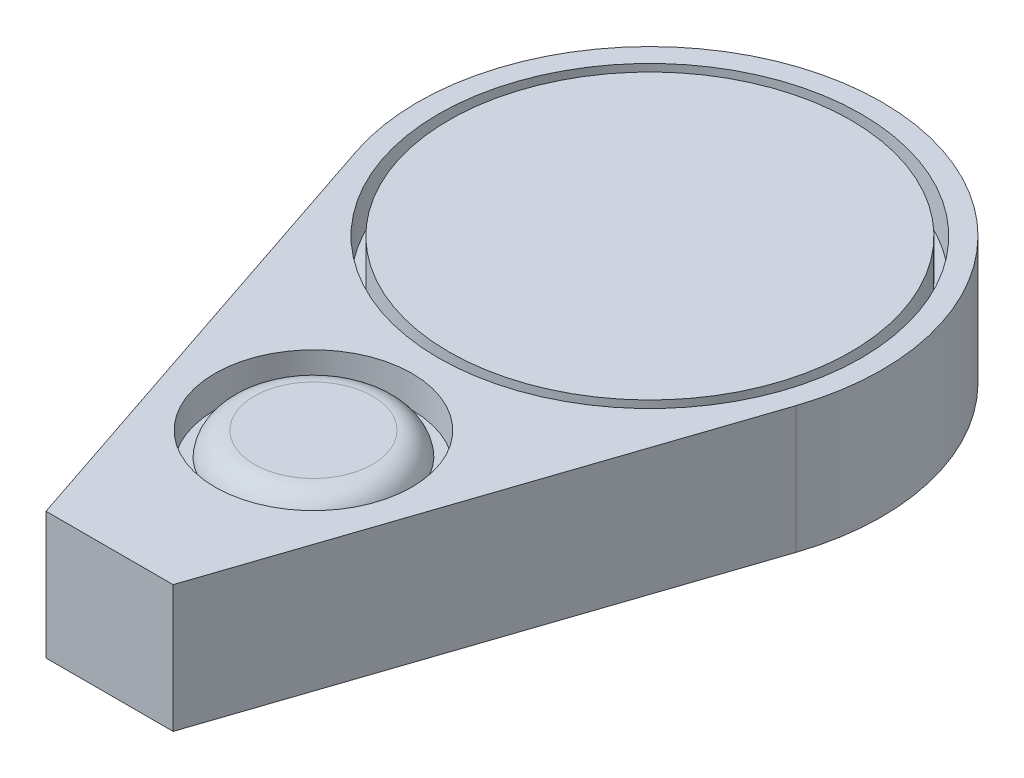
ISO-10303-21;
HEADER;
FILE_DESCRIPTION(('STEP AP214'),'2;1');
FILE_NAME('part.step','',(''),(''),'','','');
FILE_SCHEMA(('AUTOMOTIVE_DESIGN { 1 0 10303 214 1 1 1 1 }'));
ENDSEC;
DATA;
#1=APPLICATION_CONTEXT('core data for automotive mechanical design processes');
#2=APPLICATION_PROTOCOL_DEFINITION('international standard','automotive_design',2000,#1);
#3=PRODUCT_CONTEXT('',#1,'mechanical');
#4=PRODUCT('Part','Part','',(#3));
#5=PRODUCT_RELATED_PRODUCT_CATEGORY('part','',(#4));
#6=PRODUCT_DEFINITION_FORMATION('','',#4);
#7=PRODUCT_DEFINITION_CONTEXT('part definition',#1,'design');
#8=PRODUCT_DEFINITION('design','',#6,#7);
#9=PRODUCT_DEFINITION_SHAPE('','',#8);
#10=(LENGTH_UNIT() NAMED_UNIT(*) SI_UNIT(.MILLI.,.METRE.));
#11=(NAMED_UNIT(*) PLANE_ANGLE_UNIT() SI_UNIT($,.RADIAN.));
#12=(NAMED_UNIT(*) SI_UNIT($,.STERADIAN.) SOLID_ANGLE_UNIT());
#13=UNCERTAINTY_MEASURE_WITH_UNIT(LENGTH_MEASURE(1.E-05),#10,'distance_accuracy_value','');
#14=(GEOMETRIC_REPRESENTATION_CONTEXT(3) GLOBAL_UNCERTAINTY_ASSIGNED_CONTEXT((#13)) GLOBAL_UNIT_ASSIGNED_CONTEXT((#10,
#11,#12)) REPRESENTATION_CONTEXT('',''));
#15=CARTESIAN_POINT('',(0.,0.,0.));
#16=DIRECTION('',(0.,0.,1.));
#17=DIRECTION('',(1.,0.,0.));
#18=AXIS2_PLACEMENT_3D('',#15,#16,#17);
#19=CARTESIAN_POINT('',(0.,15.,52.9264570661834));
#20=DIRECTION('',(0.,1.,0.));
#21=DIRECTION('',(0.,0.,1.));
#22=AXIS2_PLACEMENT_3D('',#19,#20,#21);
#23=PLANE('',#22);
#24=CARTESIAN_POINT('',(0.,15.,52.9264570661834));
#25=DIRECTION('',(0.,1.,0.));
#26=DIRECTION('',(0.,0.,1.));
#27=AXIS2_PLACEMENT_3D('',#24,#25,#26);
#28=CIRCLE('',#27,15.5);
#29=CARTESIAN_POINT('',(0.,15.,68.4264570661834));
#30=VERTEX_POINT('',#29);
#31=EDGE_CURVE('E106',#30,#30,#28,.T.);
#32=ORIENTED_EDGE('',*,*,#31,.T.);
#33=EDGE_LOOP('',(#32));
#34=FACE_BOUND('',#33,.T.);
#35=CARTESIAN_POINT('',(0.,15.,52.9264570661834));
#36=DIRECTION('',(0.,1.,0.));
#37=DIRECTION('',(0.,0.,1.));
#38=AXIS2_PLACEMENT_3D('',#35,#36,#37);
#39=CIRCLE('',#38,12.3);
#40=CARTESIAN_POINT('',(0.,15.,65.2264570661834));
#41=VERTEX_POINT('',#40);
#42=EDGE_CURVE('E274',#41,#41,#39,.T.);
#43=ORIENTED_EDGE('',*,*,#42,.F.);
#44=EDGE_LOOP('',(#43));
#45=FACE_BOUND('',#44,.T.);
#46=ADVANCED_FACE('F35',(#34,#45),#23,.T.);
#47=CARTESIAN_POINT('',(0.,20.,0.));
#48=DIRECTION('',(0.,-1.,0.));
#49=DIRECTION('',(0.,0.,-1.));
#50=AXIS2_PLACEMENT_3D('',#47,#48,#49);
#51=CYLINDRICAL_SURFACE('',#50,36.5);
#52=DIRECTION('',(0.,-1.,0.));
#53=VECTOR('',#52,1.);
#54=CARTESIAN_POINT('',(-34.6069461089241,120.885138048854,11.6021239871854));
#55=LINE('',#54,#53);
#56=CARTESIAN_POINT('',(-34.6069461089241,20.,11.6021239871854));
#57=VERTEX_POINT('',#56);
#58=CARTESIAN_POINT('',(-34.6069461089241,0.,11.6021239871854));
#59=VERTEX_POINT('',#58);
#60=EDGE_CURVE('E50',#57,#59,#55,.T.);
#61=ORIENTED_EDGE('',*,*,#60,.F.);
#62=CARTESIAN_POINT('',(0.,20.,0.));
#63=DIRECTION('',(0.,1.,0.));
#64=DIRECTION('',(0.,0.,1.));
#65=AXIS2_PLACEMENT_3D('',#62,#63,#64);
#66=CIRCLE('',#65,36.5);
#67=CARTESIAN_POINT('',(34.6069461089241,20.,11.6021239871854));
#68=VERTEX_POINT('',#67);
#69=EDGE_CURVE('E11',#68,#57,#66,.T.);
#70=ORIENTED_EDGE('',*,*,#69,.F.);
#71=DIRECTION('',(0.,-1.,0.));
#72=VECTOR('',#71,1.);
#73=CARTESIAN_POINT('',(34.6069461089241,120.885138048854,11.6021239871854));
#74=LINE('',#73,#72);
#75=CARTESIAN_POINT('',(34.6069461089241,0.,11.6021239871854));
#76=VERTEX_POINT('',#75);
#77=EDGE_CURVE('E88',#68,#76,#74,.T.);
#78=ORIENTED_EDGE('',*,*,#77,.T.);
#79=CARTESIAN_POINT('',(0.,0.,0.));
#80=DIRECTION('',(0.,1.,0.));
#81=DIRECTION('',(0.,0.,1.));
#82=AXIS2_PLACEMENT_3D('',#79,#80,#81);
#83=CIRCLE('',#82,36.5);
#84=EDGE_CURVE('E39',#76,#59,#83,.T.);
#85=ORIENTED_EDGE('',*,*,#84,.T.);
#86=EDGE_LOOP('',(#61,#70,#78,#85));
#87=FACE_BOUND('',#86,.T.);
#88=ADVANCED_FACE('F37',(#87),#51,.T.);
#89=CARTESIAN_POINT('',(0.,20.,0.));
#90=DIRECTION('',(0.,1.,0.));
#91=DIRECTION('',(0.,0.,1.));
#92=AXIS2_PLACEMENT_3D('',#89,#90,#91);
#93=PLANE('',#92);
#94=CARTESIAN_POINT('',(0.,20.,52.9264570661834));
#95=DIRECTION('',(0.,1.,0.));
#96=DIRECTION('',(0.,0.,1.));
#97=AXIS2_PLACEMENT_3D('',#94,#95,#96);
#98=CIRCLE('',#97,15.5);
#99=CARTESIAN_POINT('',(0.,20.,68.4264570661834));
#100=VERTEX_POINT('',#99);
#101=EDGE_CURVE('E282',#100,#100,#98,.T.);
#102=ORIENTED_EDGE('',*,*,#101,.F.);
#103=EDGE_LOOP('',(#102));
#104=FACE_BOUND('',#103,.T.);
#105=CARTESIAN_POINT('',(0.,20.,0.));
#106=DIRECTION('',(0.,1.,0.));
#107=DIRECTION('',(0.,0.,1.));
#108=AXIS2_PLACEMENT_3D('',#105,#106,#107);
#109=CIRCLE('',#108,33.25);
#110=CARTESIAN_POINT('',(0.,20.,33.25));
#111=VERTEX_POINT('',#110);
#112=EDGE_CURVE('E112',#111,#111,#109,.T.);
#113=ORIENTED_EDGE('',*,*,#112,.F.);
#114=EDGE_LOOP('',(#113));
#115=FACE_BOUND('',#114,.T.);
#116=ORIENTED_EDGE('',*,*,#69,.T.);
#117=DIRECTION('',(0.317866410607819,0.,0.948135509833537));
#118=VECTOR('',#117,1.);
#119=CARTESIAN_POINT('',(-34.6069461089241,20.,11.6021239871854));
#120=LINE('',#119,#118);
#121=CARTESIAN_POINT('',(-10.,20.,85.));
#122=VERTEX_POINT('',#121);
#123=EDGE_CURVE('E95',#57,#122,#120,.T.);
#124=ORIENTED_EDGE('',*,*,#123,.T.);
#125=DIRECTION('',(1.,0.,0.));
#126=VECTOR('',#125,1.);
#127=CARTESIAN_POINT('',(0.,20.,85.));
#128=LINE('',#127,#126);
#129=CARTESIAN_POINT('',(10.,20.,85.));
#130=VERTEX_POINT('',#129);
#131=EDGE_CURVE('E76',#122,#130,#128,.T.);
#132=ORIENTED_EDGE('',*,*,#131,.T.);
#133=DIRECTION('',(0.317866410607819,0.,-0.948135509833537));
#134=VECTOR('',#133,1.);
#135=CARTESIAN_POINT('',(34.6069461089241,20.,11.6021239871854));
#136=LINE('',#135,#134);
#137=EDGE_CURVE('E86',#130,#68,#136,.T.);
#138=ORIENTED_EDGE('',*,*,#137,.T.);
#139=EDGE_LOOP('',(#116,#124,#132,#138));
#140=FACE_BOUND('',#139,.T.);
#141=ADVANCED_FACE('F93',(#104,#115,#140),#93,.T.);
#142=CARTESIAN_POINT('',(0.,0.,0.));
#143=DIRECTION('',(0.,1.,0.));
#144=DIRECTION('',(0.,0.,1.));
#145=AXIS2_PLACEMENT_3D('',#142,#143,#144);
#146=PLANE('',#145);
#147=ORIENTED_EDGE('',*,*,#84,.F.);
#148=DIRECTION('',(0.317866410607819,0.,-0.948135509833537));
#149=VECTOR('',#148,1.);
#150=CARTESIAN_POINT('',(34.6069461089241,0.,11.6021239871854));
#151=LINE('',#150,#149);
#152=CARTESIAN_POINT('',(10.,0.,85.));
#153=VERTEX_POINT('',#152);
#154=EDGE_CURVE('E83',#153,#76,#151,.T.);
#155=ORIENTED_EDGE('',*,*,#154,.F.);
#156=DIRECTION('',(1.,0.,0.));
#157=VECTOR('',#156,1.);
#158=CARTESIAN_POINT('',(0.,0.,85.));
#159=LINE('',#158,#157);
#160=CARTESIAN_POINT('',(-10.,0.,85.));
#161=VERTEX_POINT('',#160);
#162=EDGE_CURVE('E79',#161,#153,#159,.T.);
#163=ORIENTED_EDGE('',*,*,#162,.F.);
#164=DIRECTION('',(0.317866410607819,0.,0.948135509833537));
#165=VECTOR('',#164,1.);
#166=CARTESIAN_POINT('',(-34.6069461089241,0.,11.6021239871854));
#167=LINE('',#166,#165);
#168=EDGE_CURVE('E99',#59,#161,#167,.T.);
#169=ORIENTED_EDGE('',*,*,#168,.F.);
#170=EDGE_LOOP('',(#147,#155,#163,#169));
#171=FACE_BOUND('',#170,.T.);
#172=ADVANCED_FACE('F122',(#171),#146,.F.);
#173=CARTESIAN_POINT('',(0.,13.5,0.));
#174=DIRECTION('',(0.,1.,0.));
#175=DIRECTION('',(0.,0.,1.));
#176=AXIS2_PLACEMENT_3D('',#173,#174,#175);
#177=CYLINDRICAL_SURFACE('',#176,33.25);
#178=CARTESIAN_POINT('',(0.,13.5,0.));
#179=DIRECTION('',(0.,1.,0.));
#180=DIRECTION('',(0.,0.,1.));
#181=AXIS2_PLACEMENT_3D('',#178,#179,#180);
#182=CIRCLE('',#181,33.25);
#183=CARTESIAN_POINT('',(0.,13.5,33.25));
#184=VERTEX_POINT('',#183);
#185=EDGE_CURVE('E113',#184,#184,#182,.T.);
#186=CARTESIAN_POINT('',(0.,13.5,33.25));
#187=CARTESIAN_POINT('',(0.,13.5677083333333,33.25));
#188=CARTESIAN_POINT('',(0.,13.6354166666667,33.25));
#189=CARTESIAN_POINT('',(0.,13.7708333333333,33.25));
#190=CARTESIAN_POINT('',(0.,13.8385416666667,33.25));
#191=CARTESIAN_POINT('',(0.,13.9739583333333,33.25));
#192=CARTESIAN_POINT('',(0.,14.0416666666667,33.25));
#193=CARTESIAN_POINT('',(0.,14.1770833333333,33.25));
#194=CARTESIAN_POINT('',(0.,14.2447916666667,33.25));
#195=CARTESIAN_POINT('',(0.,14.3802083333333,33.25));
#196=CARTESIAN_POINT('',(0.,14.4479166666667,33.25));
#197=CARTESIAN_POINT('',(0.,14.5833333333333,33.25));
#198=CARTESIAN_POINT('',(0.,14.6510416666667,33.25));
#199=CARTESIAN_POINT('',(0.,14.7864583333333,33.25));
#200=CARTESIAN_POINT('',(0.,14.8541666666667,33.25));
#201=CARTESIAN_POINT('',(0.,14.9895833333333,33.25));
#202=CARTESIAN_POINT('',(0.,15.0572916666667,33.25));
#203=CARTESIAN_POINT('',(0.,15.1927083333333,33.25));
#204=CARTESIAN_POINT('',(0.,15.2604166666667,33.25));
#205=CARTESIAN_POINT('',(0.,15.3958333333333,33.25));
#206=CARTESIAN_POINT('',(0.,15.4635416666667,33.25));
#207=CARTESIAN_POINT('',(0.,15.5989583333333,33.25));
#208=CARTESIAN_POINT('',(0.,15.6666666666667,33.25));
#209=CARTESIAN_POINT('',(0.,15.8020833333333,33.25));
#210=CARTESIAN_POINT('',(0.,15.8697916666667,33.25));
#211=CARTESIAN_POINT('',(0.,16.0052083333333,33.25));
#212=CARTESIAN_POINT('',(0.,16.0729166666667,33.25));
#213=CARTESIAN_POINT('',(0.,16.2083333333333,33.25));
#214=CARTESIAN_POINT('',(0.,16.2760416666667,33.25));
#215=CARTESIAN_POINT('',(0.,16.4114583333333,33.25));
#216=CARTESIAN_POINT('',(0.,16.4791666666667,33.25));
#217=CARTESIAN_POINT('',(0.,16.6145833333333,33.25));
#218=CARTESIAN_POINT('',(0.,16.6822916666667,33.25));
#219=CARTESIAN_POINT('',(0.,16.8177083333333,33.25));
#220=CARTESIAN_POINT('',(0.,16.8854166666667,33.25));
#221=CARTESIAN_POINT('',(0.,17.0208333333333,33.25));
#222=CARTESIAN_POINT('',(0.,17.0885416666667,33.25));
#223=CARTESIAN_POINT('',(0.,17.2239583333333,33.25));
#224=CARTESIAN_POINT('',(0.,17.2916666666667,33.25));
#225=CARTESIAN_POINT('',(0.,17.4270833333333,33.25));
#226=CARTESIAN_POINT('',(0.,17.4947916666667,33.25));
#227=CARTESIAN_POINT('',(0.,17.6302083333333,33.25));
#228=CARTESIAN_POINT('',(0.,17.6979166666667,33.25));
#229=CARTESIAN_POINT('',(0.,17.8333333333333,33.25));
#230=CARTESIAN_POINT('',(0.,17.9010416666667,33.25));
#231=CARTESIAN_POINT('',(0.,18.0364583333333,33.25));
#232=CARTESIAN_POINT('',(0.,18.1041666666667,33.25));
#233=CARTESIAN_POINT('',(0.,18.2395833333333,33.25));
#234=CARTESIAN_POINT('',(0.,18.3072916666667,33.25));
#235=CARTESIAN_POINT('',(0.,18.4427083333333,33.25));
#236=CARTESIAN_POINT('',(0.,18.5104166666667,33.25));
#237=CARTESIAN_POINT('',(0.,18.6458333333333,33.25));
#238=CARTESIAN_POINT('',(0.,18.7135416666667,33.25));
#239=CARTESIAN_POINT('',(0.,18.8489583333333,33.25));
#240=CARTESIAN_POINT('',(0.,18.9166666666667,33.25));
#241=CARTESIAN_POINT('',(0.,19.0520833333333,33.25));
#242=CARTESIAN_POINT('',(0.,19.1197916666667,33.25));
#243=CARTESIAN_POINT('',(0.,19.2552083333333,33.25));
#244=CARTESIAN_POINT('',(0.,19.3229166666667,33.25));
#245=CARTESIAN_POINT('',(0.,19.4583333333333,33.25));
#246=CARTESIAN_POINT('',(0.,19.5260416666667,33.25));
#247=CARTESIAN_POINT('',(0.,19.6614583333333,33.25));
#248=CARTESIAN_POINT('',(0.,19.7291666666667,33.25));
#249=CARTESIAN_POINT('',(0.,19.8645833333333,33.25));
#250=CARTESIAN_POINT('',(0.,19.9322916666667,33.25));
#251=CARTESIAN_POINT('',(0.,20.,33.25));
#252=B_SPLINE_CURVE_WITH_KNOTS('',3,(#186,#187,#188,#189,#190,#191,#192,#193,#194,#195,#196,
#197,#198,#199,#200,#201,#202,#203,#204,#205,#206,#207,#208,#209,#210,#211,#212,#213,#214,#215,
#216,#217,#218,#219,#220,#221,#222,#223,#224,#225,#226,#227,#228,#229,#230,#231,#232,#233,#234,
#235,#236,#237,#238,#239,#240,#241,#242,#243,#244,#245,#246,#247,#248,#249,#250,#251),
.UNSPECIFIED.,.F.,.F.,(4,2,2,2,2,2,2,2,2,2,2,2,2,2,2,2,2,2,2,2,2,2,2,2,2,2,2,2,2,2,2,2,4),(0.,
0.203125,0.40625,0.609375000000001,0.812500000000001,1.015625,1.21875,1.421875,1.625,1.828125,
2.03125,2.234375,2.4375,2.640625,2.84375,3.046875,3.25,3.453125,3.65625,3.859375,4.0625,
4.265625,4.46875,4.671875,4.875,5.078125,5.28125,5.484375,5.6875,5.890625,6.09375,6.296875,6.5),.UNSPECIFIED.);
#253=EDGE_CURVE('BSEAM119',#184,#111,#252,.T.);
#254=ORIENTED_EDGE('',*,*,#185,.F.);
#255=ORIENTED_EDGE('',*,*,#112,.T.);
#256=ORIENTED_EDGE('',*,*,#253,.T.);
#257=ORIENTED_EDGE('',*,*,#253,.F.);
#258=EDGE_LOOP('',(#254,#256,#255,#257));
#259=FACE_BOUND('',#258,.T.);
#260=ADVANCED_FACE('F119',(#259),#177,.F.);
#261=CARTESIAN_POINT('',(0.,13.5,0.));
#262=DIRECTION('',(0.,1.,0.));
#263=DIRECTION('',(0.,0.,1.));
#264=AXIS2_PLACEMENT_3D('',#261,#262,#263);
#265=PLANE('',#264);
#266=CARTESIAN_POINT('',(0.,13.5,0.));
#267=DIRECTION('',(0.,1.,0.));
#268=DIRECTION('',(0.,0.,1.));
#269=AXIS2_PLACEMENT_3D('',#266,#267,#268);
#270=CIRCLE('',#269,31.6);
#271=CARTESIAN_POINT('',(0.,13.5,31.6));
#272=VERTEX_POINT('',#271);
#273=EDGE_CURVE('E90',#272,#272,#270,.T.);
#274=ORIENTED_EDGE('',*,*,#273,.F.);
#275=EDGE_LOOP('',(#274));
#276=FACE_BOUND('',#275,.T.);
#277=ORIENTED_EDGE('',*,*,#185,.T.);
#278=EDGE_LOOP('',(#277));
#279=FACE_BOUND('',#278,.T.);
#280=ADVANCED_FACE('F160',(#276,#279),#265,.T.);
#281=CARTESIAN_POINT('',(0.,109.37829714198,0.));
#282=DIRECTION('',(0.,-1.,0.));
#283=DIRECTION('',(0.,0.,-1.));
#284=AXIS2_PLACEMENT_3D('',#281,#282,#283);
#285=CYLINDRICAL_SURFACE('',#284,31.6);
#286=ORIENTED_EDGE('',*,*,#273,.T.);
#287=EDGE_LOOP('',(#286));
#288=FACE_BOUND('',#287,.T.);
#289=CARTESIAN_POINT('',(0.,20.,0.));
#290=DIRECTION('',(0.,1.,0.));
#291=DIRECTION('',(0.,0.,1.));
#292=AXIS2_PLACEMENT_3D('',#289,#290,#291);
#293=CIRCLE('',#292,31.6);
#294=CARTESIAN_POINT('',(0.,20.,31.6));
#295=VERTEX_POINT('',#294);
#296=EDGE_CURVE('E109',#295,#295,#293,.T.);
#297=ORIENTED_EDGE('',*,*,#296,.F.);
#298=EDGE_LOOP('',(#297));
#299=FACE_BOUND('',#298,.T.);
#300=ADVANCED_FACE('F157',(#288,#299),#285,.T.);
#301=CARTESIAN_POINT('',(0.,20.,0.));
#302=DIRECTION('',(0.,1.,0.));
#303=DIRECTION('',(0.,0.,1.));
#304=AXIS2_PLACEMENT_3D('',#301,#302,#303);
#305=PLANE('',#304);
#306=ORIENTED_EDGE('',*,*,#296,.T.);
#307=EDGE_LOOP('',(#306));
#308=FACE_BOUND('',#307,.T.);
#309=ADVANCED_FACE('F155',(#308),#305,.T.);
#310=CARTESIAN_POINT('',(-34.6069461089241,120.885138048854,11.6021239871854));
#311=DIRECTION('',(0.948135509833537,0.,-0.317866410607819));
#312=DIRECTION('',(-0.317866410607819,0.,-0.948135509833537));
#313=AXIS2_PLACEMENT_3D('',#310,#311,#312);
#314=PLANE('',#313);
#315=ORIENTED_EDGE('',*,*,#123,.F.);
#316=ORIENTED_EDGE('',*,*,#60,.T.);
#317=ORIENTED_EDGE('',*,*,#168,.T.);
#318=DIRECTION('',(0.,-1.,0.));
#319=VECTOR('',#318,1.);
#320=CARTESIAN_POINT('',(-10.,120.885138048854,85.));
#321=LINE('',#320,#319);
#322=EDGE_CURVE('E103',#122,#161,#321,.T.);
#323=ORIENTED_EDGE('',*,*,#322,.F.);
#324=EDGE_LOOP('',(#315,#316,#317,#323));
#325=FACE_BOUND('',#324,.T.);
#326=ADVANCED_FACE('F152',(#325),#314,.F.);
#327=CARTESIAN_POINT('',(0.,120.885138048854,85.));
#328=DIRECTION('',(0.,0.,-1.));
#329=DIRECTION('',(-1.,0.,0.));
#330=AXIS2_PLACEMENT_3D('',#327,#328,#329);
#331=PLANE('',#330);
#332=ORIENTED_EDGE('',*,*,#131,.F.);
#333=ORIENTED_EDGE('',*,*,#322,.T.);
#334=ORIENTED_EDGE('',*,*,#162,.T.);
#335=DIRECTION('',(0.,-1.,0.));
#336=VECTOR('',#335,1.);
#337=CARTESIAN_POINT('',(10.,120.885138048854,85.));
#338=LINE('',#337,#336);
#339=EDGE_CURVE('E72',#130,#153,#338,.T.);
#340=ORIENTED_EDGE('',*,*,#339,.F.);
#341=EDGE_LOOP('',(#332,#333,#334,#340));
#342=FACE_BOUND('',#341,.T.);
#343=ADVANCED_FACE('F74',(#342),#331,.F.);
#344=CARTESIAN_POINT('',(34.6069461089241,120.885138048854,11.6021239871854));
#345=DIRECTION('',(-0.948135509833537,0.,-0.317866410607819));
#346=DIRECTION('',(-0.317866410607819,0.,0.948135509833537));
#347=AXIS2_PLACEMENT_3D('',#344,#345,#346);
#348=PLANE('',#347);
#349=ORIENTED_EDGE('',*,*,#137,.F.);
#350=ORIENTED_EDGE('',*,*,#339,.T.);
#351=ORIENTED_EDGE('',*,*,#154,.T.);
#352=ORIENTED_EDGE('',*,*,#77,.F.);
#353=EDGE_LOOP('',(#349,#350,#351,#352));
#354=FACE_BOUND('',#353,.T.);
#355=ADVANCED_FACE('F87',(#354),#348,.F.);
#356=CARTESIAN_POINT('',(0.,15.,52.9264570661834));
#357=DIRECTION('',(0.,1.,0.));
#358=DIRECTION('',(0.,0.,1.));
#359=AXIS2_PLACEMENT_3D('',#356,#357,#358);
#360=CYLINDRICAL_SURFACE('',#359,15.5);
#361=ORIENTED_EDGE('',*,*,#31,.F.);
#362=EDGE_LOOP('',(#361));
#363=FACE_BOUND('',#362,.T.);
#364=ORIENTED_EDGE('',*,*,#101,.T.);
#365=EDGE_LOOP('',(#364));
#366=FACE_BOUND('',#365,.T.);
#367=ADVANCED_FACE('F143',(#363,#366),#360,.F.);
#368=CARTESIAN_POINT('',(0.,15.8652777777778,52.9264570661834));
#369=DIRECTION('',(0.,1.,0.));
#370=DIRECTION('',(0.,0.,1.));
#371=AXIS2_PLACEMENT_3D('',#368,#369,#370);
#372=TOROIDAL_SURFACE('',#371,9.3,4.13472222222221);
#373=CARTESIAN_POINT('',(0.,20.,52.9264570661834));
#374=DIRECTION('',(0.,1.,0.));
#375=DIRECTION('',(0.,0.,1.));
#376=AXIS2_PLACEMENT_3D('',#373,#374,#375);
#377=CIRCLE('',#376,9.3);
#378=CARTESIAN_POINT('',(0.,20.,62.2264570661834));
#379=VERTEX_POINT('',#378);
#380=EDGE_CURVE('E273',#379,#379,#377,.T.);
#381=ORIENTED_EDGE('',*,*,#380,.F.);
#382=EDGE_LOOP('',(#381));
#383=FACE_BOUND('',#382,.T.);
#384=CARTESIAN_POINT('',(0.,16.4,52.9264570661834));
#385=DIRECTION('',(0.,1.,0.));
#386=DIRECTION('',(0.,0.,1.));
#387=AXIS2_PLACEMENT_3D('',#384,#385,#386);
#388=CIRCLE('',#387,13.4);
#389=CARTESIAN_POINT('',(0.,16.4,66.3264570661834));
#390=VERTEX_POINT('',#389);
#391=EDGE_CURVE('E277',#390,#390,#388,.T.);
#392=ORIENTED_EDGE('',*,*,#391,.T.);
#393=EDGE_LOOP('',(#392));
#394=FACE_BOUND('',#393,.T.);
#395=ADVANCED_FACE('F146',(#383,#394),#372,.T.);
#396=CARTESIAN_POINT('',(0.,15.,52.9264570661834));
#397=DIRECTION('',(0.,1.,0.));
#398=DIRECTION('',(0.,0.,1.));
#399=AXIS2_PLACEMENT_3D('',#396,#397,#398);
#400=CONICAL_SURFACE('',#399,12.3,0.665969237379104);
#401=ORIENTED_EDGE('',*,*,#391,.F.);
#402=EDGE_LOOP('',(#401));
#403=FACE_BOUND('',#402,.T.);
#404=ORIENTED_EDGE('',*,*,#42,.T.);
#405=EDGE_LOOP('',(#404));
#406=FACE_BOUND('',#405,.T.);
#407=ADVANCED_FACE('F211',(#403,#406),#400,.T.);
#408=CARTESIAN_POINT('',(0.,20.,0.));
#409=DIRECTION('',(0.,1.,0.));
#410=DIRECTION('',(0.,0.,1.));
#411=AXIS2_PLACEMENT_3D('',#408,#409,#410);
#412=PLANE('',#411);
#413=ORIENTED_EDGE('',*,*,#380,.T.);
#414=EDGE_LOOP('',(#413));
#415=FACE_BOUND('',#414,.T.);
#416=ADVANCED_FACE('F141',(#415),#412,.T.);
#417=CLOSED_SHELL('',(#46,#88,#141,#172,#260,#280,#300,#309,#326,#343,#355,#367,#395,#407,#416));
#418=MANIFOLD_SOLID_BREP('B2',#417);
#419=ADVANCED_BREP_SHAPE_REPRESENTATION('',(#18,#418),#14);
#420=SHAPE_DEFINITION_REPRESENTATION(#9,#419);
ENDSEC;
END-ISO-10303-21;
